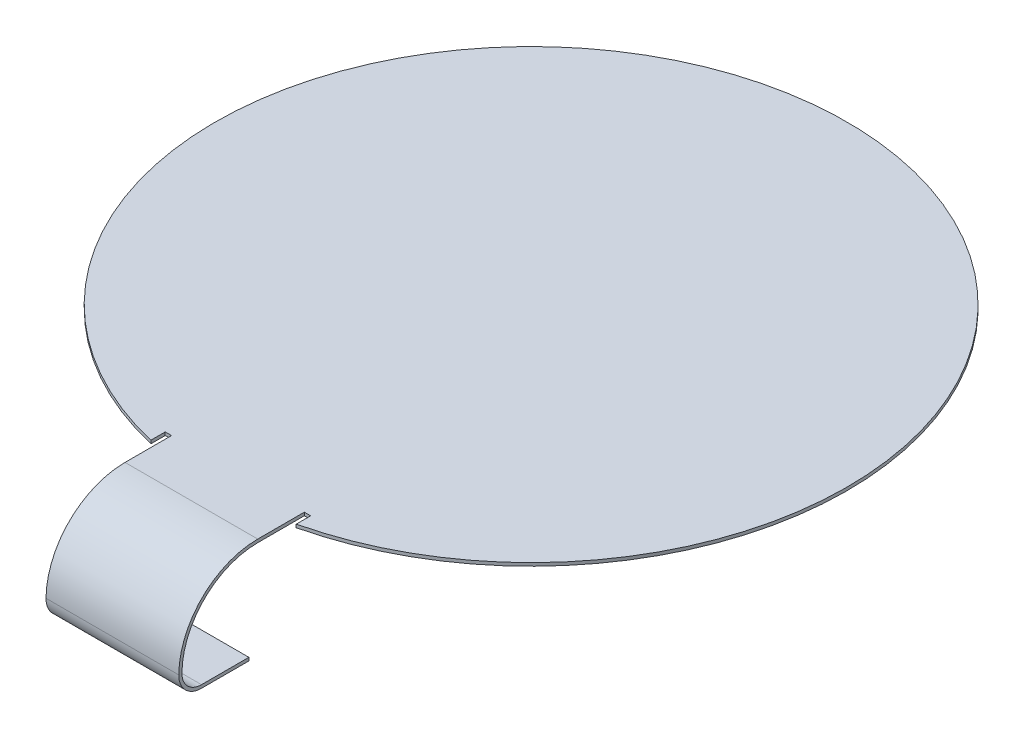
ISO-10303-21;
HEADER;
FILE_DESCRIPTION(('STEP AP214'),'2;1');
FILE_NAME('part.step','',(''),(''),'','','');
FILE_SCHEMA(('AUTOMOTIVE_DESIGN { 1 0 10303 214 1 1 1 1 }'));
ENDSEC;
DATA;
#1=APPLICATION_CONTEXT('core data for automotive mechanical design processes');
#2=APPLICATION_PROTOCOL_DEFINITION('international standard','automotive_design',2000,#1);
#3=PRODUCT_CONTEXT('',#1,'mechanical');
#4=PRODUCT('Part','Part','',(#3));
#5=PRODUCT_RELATED_PRODUCT_CATEGORY('part','',(#4));
#6=PRODUCT_DEFINITION_FORMATION('','',#4);
#7=PRODUCT_DEFINITION_CONTEXT('part definition',#1,'design');
#8=PRODUCT_DEFINITION('design','',#6,#7);
#9=PRODUCT_DEFINITION_SHAPE('','',#8);
#10=(LENGTH_UNIT() NAMED_UNIT(*) SI_UNIT(.MILLI.,.METRE.));
#11=(NAMED_UNIT(*) PLANE_ANGLE_UNIT() SI_UNIT($,.RADIAN.));
#12=(NAMED_UNIT(*) SI_UNIT($,.STERADIAN.) SOLID_ANGLE_UNIT());
#13=UNCERTAINTY_MEASURE_WITH_UNIT(LENGTH_MEASURE(1.E-05),#10,'distance_accuracy_value','');
#14=(GEOMETRIC_REPRESENTATION_CONTEXT(3) GLOBAL_UNCERTAINTY_ASSIGNED_CONTEXT((#13)) GLOBAL_UNIT_ASSIGNED_CONTEXT((#10,
#11,#12)) REPRESENTATION_CONTEXT('',''));
#15=CARTESIAN_POINT('',(0.,0.,0.));
#16=DIRECTION('',(0.,0.,1.));
#17=DIRECTION('',(1.,0.,0.));
#18=AXIS2_PLACEMENT_3D('',#15,#16,#17);
#19=CARTESIAN_POINT('',(0.,1.2,-1.53064501));
#20=DIRECTION('',(0.,-1.,0.));
#21=DIRECTION('',(0.,0.,-1.));
#22=AXIS2_PLACEMENT_3D('',#19,#20,#21);
#23=CYLINDRICAL_SURFACE('',#22,10.);
#24=CARTESIAN_POINT('',(0.,1.1,-1.53064501));
#25=DIRECTION('',(0.,1.,0.));
#26=DIRECTION('',(0.,0.,1.));
#27=AXIS2_PLACEMENT_3D('',#24,#25,#26);
#28=CIRCLE('',#27,10.);
#29=CARTESIAN_POINT('',(2.3,1.1,8.20126127808149));
#30=VERTEX_POINT('',#29);
#31=CARTESIAN_POINT('',(-2.3,1.1,8.20126127808149));
#32=VERTEX_POINT('',#31);
#33=EDGE_CURVE('E259',#30,#32,#28,.T.);
#34=ORIENTED_EDGE('',*,*,#33,.T.);
#35=DIRECTION('',(0.,-1.,0.));
#36=VECTOR('',#35,1.);
#37=CARTESIAN_POINT('',(-2.3,1.2,8.20126127808149));
#38=LINE('',#37,#36);
#39=CARTESIAN_POINT('',(-2.3,1.2,8.20126127808149));
#40=VERTEX_POINT('',#39);
#41=EDGE_CURVE('E152',#32,#40,#38,.F.);
#42=ORIENTED_EDGE('',*,*,#41,.T.);
#43=CARTESIAN_POINT('',(0.,1.2,-1.53064501));
#44=DIRECTION('',(0.,1.,0.));
#45=DIRECTION('',(0.,0.,1.));
#46=AXIS2_PLACEMENT_3D('',#43,#44,#45);
#47=CIRCLE('',#46,10.);
#48=CARTESIAN_POINT('',(2.3,1.2,8.20126127808149));
#49=VERTEX_POINT('',#48);
#50=EDGE_CURVE('E46',#49,#40,#47,.T.);
#51=ORIENTED_EDGE('',*,*,#50,.F.);
#52=DIRECTION('',(0.,-1.,0.));
#53=VECTOR('',#52,1.);
#54=CARTESIAN_POINT('',(2.3,1.2,8.20126127808149));
#55=LINE('',#54,#53);
#56=EDGE_CURVE('E183',#49,#30,#55,.T.);
#57=ORIENTED_EDGE('',*,*,#56,.T.);
#58=EDGE_LOOP('',(#34,#42,#51,#57));
#59=FACE_BOUND('',#58,.T.);
#60=ADVANCED_FACE('F38',(#59),#23,.T.);
#61=CARTESIAN_POINT('',(0.,1.2,-1.53064501));
#62=DIRECTION('',(0.,1.,0.));
#63=DIRECTION('',(0.,0.,1.));
#64=AXIS2_PLACEMENT_3D('',#61,#62,#63);
#65=PLANE('',#64);
#66=DIRECTION('',(-1.,0.,0.));
#67=VECTOR('',#66,1.);
#68=CARTESIAN_POINT('',(-2.1,1.2,7.74636884904715));
#69=LINE('',#68,#67);
#70=CARTESIAN_POINT('',(-2.1,1.2,7.74636884904715));
#71=VERTEX_POINT('',#70);
#72=CARTESIAN_POINT('',(-2.3,1.2,7.74636884904715));
#73=VERTEX_POINT('',#72);
#74=EDGE_CURVE('E159',#71,#73,#69,.T.);
#75=ORIENTED_EDGE('',*,*,#74,.F.);
#76=DIRECTION('',(0.,0.,1.));
#77=VECTOR('',#76,1.);
#78=CARTESIAN_POINT('',(-2.1,1.2,8.46935499));
#79=LINE('',#78,#77);
#80=CARTESIAN_POINT('',(-2.1,1.2,9.21935499));
#81=VERTEX_POINT('',#80);
#82=EDGE_CURVE('E139',#71,#81,#79,.T.);
#83=ORIENTED_EDGE('',*,*,#82,.T.);
#84=DIRECTION('',(-1.,0.,0.));
#85=VECTOR('',#84,1.);
#86=CARTESIAN_POINT('',(9.5423338450823,1.2,9.21935499));
#87=LINE('',#86,#85);
#88=CARTESIAN_POINT('',(2.1,1.2,9.21935499));
#89=VERTEX_POINT('',#88);
#90=EDGE_CURVE('E283',#89,#81,#87,.T.);
#91=ORIENTED_EDGE('',*,*,#90,.F.);
#92=DIRECTION('',(0.,0.,1.));
#93=VECTOR('',#92,1.);
#94=CARTESIAN_POINT('',(2.1,1.2,8.46935499));
#95=LINE('',#94,#93);
#96=CARTESIAN_POINT('',(2.1,1.2,7.74636884904715));
#97=VERTEX_POINT('',#96);
#98=EDGE_CURVE('E256',#97,#89,#95,.T.);
#99=ORIENTED_EDGE('',*,*,#98,.F.);
#100=DIRECTION('',(-1.,0.,0.));
#101=VECTOR('',#100,1.);
#102=CARTESIAN_POINT('',(2.1,1.2,7.74636884904715));
#103=LINE('',#102,#101);
#104=CARTESIAN_POINT('',(2.3,1.2,7.74636884904715));
#105=VERTEX_POINT('',#104);
#106=EDGE_CURVE('E190',#105,#97,#103,.T.);
#107=ORIENTED_EDGE('',*,*,#106,.F.);
#108=DIRECTION('',(0.,0.,-1.));
#109=VECTOR('',#108,1.);
#110=CARTESIAN_POINT('',(2.3,1.2,8.24636884904715));
#111=LINE('',#110,#109);
#112=EDGE_CURVE('E187',#49,#105,#111,.T.);
#113=ORIENTED_EDGE('',*,*,#112,.F.);
#114=ORIENTED_EDGE('',*,*,#50,.T.);
#115=DIRECTION('',(0.,0.,1.));
#116=VECTOR('',#115,1.);
#117=CARTESIAN_POINT('',(-2.3,1.2,8.24636884904715));
#118=LINE('',#117,#116);
#119=EDGE_CURVE('E165',#73,#40,#118,.T.);
#120=ORIENTED_EDGE('',*,*,#119,.F.);
#121=EDGE_LOOP('',(#75,#83,#91,#99,#107,#113,#114,#120));
#122=FACE_BOUND('',#121,.T.);
#123=ADVANCED_FACE('F167',(#122),#65,.T.);
#124=CARTESIAN_POINT('',(0.,1.1,-1.53064501));
#125=DIRECTION('',(0.,1.,0.));
#126=DIRECTION('',(0.,0.,1.));
#127=AXIS2_PLACEMENT_3D('',#124,#125,#126);
#128=PLANE('',#127);
#129=DIRECTION('',(0.,0.,1.));
#130=VECTOR('',#129,1.);
#131=CARTESIAN_POINT('',(-2.1,1.1,8.46935499));
#132=LINE('',#131,#130);
#133=CARTESIAN_POINT('',(-2.1,1.1,7.74636884904715));
#134=VERTEX_POINT('',#133);
#135=CARTESIAN_POINT('',(-2.1,1.1,9.21935499));
#136=VERTEX_POINT('',#135);
#137=EDGE_CURVE('E231',#134,#136,#132,.T.);
#138=ORIENTED_EDGE('',*,*,#137,.F.);
#139=DIRECTION('',(1.,0.,0.));
#140=VECTOR('',#139,1.);
#141=CARTESIAN_POINT('',(-2.1,1.1,7.74636884904715));
#142=LINE('',#141,#140);
#143=CARTESIAN_POINT('',(-2.3,1.1,7.74636884904715));
#144=VERTEX_POINT('',#143);
#145=EDGE_CURVE('E162',#144,#134,#142,.T.);
#146=ORIENTED_EDGE('',*,*,#145,.F.);
#147=DIRECTION('',(0.,0.,1.));
#148=VECTOR('',#147,1.);
#149=CARTESIAN_POINT('',(-2.3,1.1,-1.53064501));
#150=LINE('',#149,#148);
#151=EDGE_CURVE('E11',#144,#32,#150,.T.);
#152=ORIENTED_EDGE('',*,*,#151,.T.);
#153=ORIENTED_EDGE('',*,*,#33,.F.);
#154=DIRECTION('',(0.,0.,1.));
#155=VECTOR('',#154,1.);
#156=CARTESIAN_POINT('',(2.3,1.1,8.24636884904715));
#157=LINE('',#156,#155);
#158=CARTESIAN_POINT('',(2.3,1.1,7.74636884904715));
#159=VERTEX_POINT('',#158);
#160=EDGE_CURVE('E170',#159,#30,#157,.T.);
#161=ORIENTED_EDGE('',*,*,#160,.F.);
#162=DIRECTION('',(1.,0.,0.));
#163=VECTOR('',#162,1.);
#164=CARTESIAN_POINT('',(2.1,1.1,7.74636884904715));
#165=LINE('',#164,#163);
#166=CARTESIAN_POINT('',(2.1,1.1,7.74636884904715));
#167=VERTEX_POINT('',#166);
#168=EDGE_CURVE('E176',#167,#159,#165,.T.);
#169=ORIENTED_EDGE('',*,*,#168,.F.);
#170=DIRECTION('',(0.,0.,1.));
#171=VECTOR('',#170,1.);
#172=CARTESIAN_POINT('',(2.1,1.1,8.46935499));
#173=LINE('',#172,#171);
#174=CARTESIAN_POINT('',(2.1,1.1,9.21935499));
#175=VERTEX_POINT('',#174);
#176=EDGE_CURVE('E239',#167,#175,#173,.T.);
#177=ORIENTED_EDGE('',*,*,#176,.T.);
#178=DIRECTION('',(-1.,0.,0.));
#179=VECTOR('',#178,1.);
#180=CARTESIAN_POINT('',(9.5423338450823,1.1,9.21935499));
#181=LINE('',#180,#179);
#182=EDGE_CURVE('E234',#175,#136,#181,.T.);
#183=ORIENTED_EDGE('',*,*,#182,.T.);
#184=EDGE_LOOP('',(#138,#146,#152,#153,#161,#169,#177,#183));
#185=FACE_BOUND('',#184,.T.);
#186=ADVANCED_FACE('F297',(#185),#128,.F.);
#187=CARTESIAN_POINT('',(2.1,-1.9,9.5));
#188=DIRECTION('',(-1.,0.,0.));
#189=DIRECTION('',(0.,0.,1.));
#190=AXIS2_PLACEMENT_3D('',#187,#188,#189);
#191=PLANE('',#190);
#192=DIRECTION('',(0.,1.,0.));
#193=VECTOR('',#192,1.);
#194=CARTESIAN_POINT('',(2.1,-1.9,9.5));
#195=LINE('',#194,#193);
#196=CARTESIAN_POINT('',(2.1,-2.,9.5));
#197=VERTEX_POINT('',#196);
#198=CARTESIAN_POINT('',(2.1,-1.9,9.5));
#199=VERTEX_POINT('',#198);
#200=EDGE_CURVE('E244',#197,#199,#195,.T.);
#201=ORIENTED_EDGE('',*,*,#200,.T.);
#202=DIRECTION('',(0.,0.,-1.));
#203=VECTOR('',#202,1.);
#204=CARTESIAN_POINT('',(2.1,-1.9,10.5));
#205=LINE('',#204,#203);
#206=CARTESIAN_POINT('',(2.1,-1.9,11.));
#207=VERTEX_POINT('',#206);
#208=EDGE_CURVE('E58',#207,#199,#205,.T.);
#209=ORIENTED_EDGE('',*,*,#208,.F.);
#210=CARTESIAN_POINT('',(2.1,-1.28074906989942,11.));
#211=DIRECTION('',(-1.,0.,0.));
#212=DIRECTION('',(0.,0.,1.));
#213=AXIS2_PLACEMENT_3D('',#210,#211,#212);
#214=CIRCLE('',#213,0.619250930100584);
#215=CARTESIAN_POINT('',(2.1,-1.27405460824191,11.619214743537));
#216=VERTEX_POINT('',#215);
#217=EDGE_CURVE('E53',#216,#207,#214,.F.);
#218=ORIENTED_EDGE('',*,*,#217,.F.);
#219=CARTESIAN_POINT('',(2.1,-1.3,9.21935499));
#220=DIRECTION('',(-1.,0.,0.));
#221=DIRECTION('',(0.,0.,1.));
#222=AXIS2_PLACEMENT_3D('',#219,#220,#221);
#223=CIRCLE('',#222,2.4);
#224=EDGE_CURVE('E235',#175,#216,#223,.F.);
#225=ORIENTED_EDGE('',*,*,#224,.F.);
#226=ORIENTED_EDGE('',*,*,#176,.F.);
#227=DIRECTION('',(0.,1.,0.));
#228=VECTOR('',#227,1.);
#229=CARTESIAN_POINT('',(2.1,0.561483519286548,7.74636884904715));
#230=LINE('',#229,#228);
#231=EDGE_CURVE('E186',#167,#97,#230,.T.);
#232=ORIENTED_EDGE('',*,*,#231,.T.);
#233=ORIENTED_EDGE('',*,*,#98,.T.);
#234=CARTESIAN_POINT('',(2.1,-1.3,9.21935499));
#235=DIRECTION('',(-1.,0.,0.));
#236=DIRECTION('',(0.,0.,1.));
#237=AXIS2_PLACEMENT_3D('',#234,#235,#236);
#238=CIRCLE('',#237,2.5);
#239=CARTESIAN_POINT('',(2.1,-1.27297355025199,11.7192088999343));
#240=VERTEX_POINT('',#239);
#241=EDGE_CURVE('E253',#89,#240,#238,.F.);
#242=ORIENTED_EDGE('',*,*,#241,.T.);
#243=CARTESIAN_POINT('',(2.1,-1.28074906989942,11.));
#244=DIRECTION('',(-1.,0.,0.));
#245=DIRECTION('',(0.,0.,1.));
#246=AXIS2_PLACEMENT_3D('',#243,#244,#245);
#247=CIRCLE('',#246,0.719250930100584);
#248=CARTESIAN_POINT('',(2.1,-2.,11.));
#249=VERTEX_POINT('',#248);
#250=EDGE_CURVE('E250',#240,#249,#247,.F.);
#251=ORIENTED_EDGE('',*,*,#250,.T.);
#252=DIRECTION('',(0.,0.,-1.));
#253=VECTOR('',#252,1.);
#254=CARTESIAN_POINT('',(2.1,-2.,10.5));
#255=LINE('',#254,#253);
#256=EDGE_CURVE('E247',#249,#197,#255,.T.);
#257=ORIENTED_EDGE('',*,*,#256,.T.);
#258=EDGE_LOOP('',(#201,#209,#218,#225,#226,#232,#233,#242,#251,#257));
#259=FACE_BOUND('',#258,.T.);
#260=ADVANCED_FACE('F322',(#259),#191,.F.);
#261=CARTESIAN_POINT('',(-2.1,-1.9,10.5));
#262=DIRECTION('',(1.,0.,0.));
#263=DIRECTION('',(0.,0.,-1.));
#264=AXIS2_PLACEMENT_3D('',#261,#262,#263);
#265=PLANE('',#264);
#266=DIRECTION('',(0.,1.,0.));
#267=VECTOR('',#266,1.);
#268=CARTESIAN_POINT('',(-2.1,-1.9,9.5));
#269=LINE('',#268,#267);
#270=CARTESIAN_POINT('',(-2.1,-2.,9.5));
#271=VERTEX_POINT('',#270);
#272=CARTESIAN_POINT('',(-2.1,-1.9,9.5));
#273=VERTEX_POINT('',#272);
#274=EDGE_CURVE('E216',#271,#273,#269,.T.);
#275=ORIENTED_EDGE('',*,*,#274,.F.);
#276=DIRECTION('',(0.,0.,-1.));
#277=VECTOR('',#276,1.);
#278=CARTESIAN_POINT('',(-2.1,-2.,10.5));
#279=LINE('',#278,#277);
#280=CARTESIAN_POINT('',(-2.1,-2.,11.));
#281=VERTEX_POINT('',#280);
#282=EDGE_CURVE('E213',#281,#271,#279,.T.);
#283=ORIENTED_EDGE('',*,*,#282,.F.);
#284=CARTESIAN_POINT('',(-2.1,-1.28074906989942,11.));
#285=DIRECTION('',(1.,0.,0.));
#286=DIRECTION('',(0.,0.,-1.));
#287=AXIS2_PLACEMENT_3D('',#284,#285,#286);
#288=CIRCLE('',#287,0.719250930100584);
#289=CARTESIAN_POINT('',(-2.1,-1.27297355025199,11.7192088999343));
#290=VERTEX_POINT('',#289);
#291=EDGE_CURVE('E209',#290,#281,#288,.T.);
#292=ORIENTED_EDGE('',*,*,#291,.F.);
#293=CARTESIAN_POINT('',(-2.1,-1.3,9.21935499));
#294=DIRECTION('',(1.,0.,0.));
#295=DIRECTION('',(0.,0.,-1.));
#296=AXIS2_PLACEMENT_3D('',#293,#294,#295);
#297=CIRCLE('',#296,2.5);
#298=EDGE_CURVE('E146',#81,#290,#297,.T.);
#299=ORIENTED_EDGE('',*,*,#298,.F.);
#300=ORIENTED_EDGE('',*,*,#82,.F.);
#301=DIRECTION('',(0.,1.,0.));
#302=VECTOR('',#301,1.);
#303=CARTESIAN_POINT('',(-2.1,0.561483519286548,7.74636884904715));
#304=LINE('',#303,#302);
#305=EDGE_CURVE('E143',#134,#71,#304,.T.);
#306=ORIENTED_EDGE('',*,*,#305,.F.);
#307=ORIENTED_EDGE('',*,*,#137,.T.);
#308=CARTESIAN_POINT('',(-2.1,-1.3,9.21935499));
#309=DIRECTION('',(1.,0.,0.));
#310=DIRECTION('',(0.,0.,-1.));
#311=AXIS2_PLACEMENT_3D('',#308,#309,#310);
#312=CIRCLE('',#311,2.4);
#313=CARTESIAN_POINT('',(-2.1,-1.27405460824191,11.619214743537));
#314=VERTEX_POINT('',#313);
#315=EDGE_CURVE('E227',#136,#314,#312,.T.);
#316=ORIENTED_EDGE('',*,*,#315,.T.);
#317=CARTESIAN_POINT('',(-2.1,-1.28074906989942,11.));
#318=DIRECTION('',(1.,0.,0.));
#319=DIRECTION('',(0.,0.,-1.));
#320=AXIS2_PLACEMENT_3D('',#317,#318,#319);
#321=CIRCLE('',#320,0.619250930100584);
#322=CARTESIAN_POINT('',(-2.1,-1.9,11.));
#323=VERTEX_POINT('',#322);
#324=EDGE_CURVE('E223',#314,#323,#321,.T.);
#325=ORIENTED_EDGE('',*,*,#324,.T.);
#326=DIRECTION('',(0.,0.,-1.));
#327=VECTOR('',#326,1.);
#328=CARTESIAN_POINT('',(-2.1,-1.9,10.5));
#329=LINE('',#328,#327);
#330=EDGE_CURVE('E220',#323,#273,#329,.T.);
#331=ORIENTED_EDGE('',*,*,#330,.T.);
#332=EDGE_LOOP('',(#275,#283,#292,#299,#300,#306,#307,#316,#325,#331));
#333=FACE_BOUND('',#332,.T.);
#334=ADVANCED_FACE('F142',(#333),#265,.F.);
#335=CARTESIAN_POINT('',(9.5423338450823,-1.3,9.21935499));
#336=DIRECTION('',(-1.,0.,0.));
#337=DIRECTION('',(0.,0.,1.));
#338=AXIS2_PLACEMENT_3D('',#335,#336,#337);
#339=CYLINDRICAL_SURFACE('',#338,2.4);
#340=ORIENTED_EDGE('',*,*,#182,.F.);
#341=ORIENTED_EDGE('',*,*,#224,.T.);
#342=DIRECTION('',(-1.,0.,0.));
#343=VECTOR('',#342,1.);
#344=CARTESIAN_POINT('',(9.5423338450823,-1.27405460824191,11.619214743537));
#345=LINE('',#344,#343);
#346=EDGE_CURVE('E263',#216,#314,#345,.T.);
#347=ORIENTED_EDGE('',*,*,#346,.T.);
#348=ORIENTED_EDGE('',*,*,#315,.F.);
#349=EDGE_LOOP('',(#340,#341,#347,#348));
#350=FACE_BOUND('',#349,.T.);
#351=ADVANCED_FACE('F341',(#350),#339,.F.);
#352=CARTESIAN_POINT('',(9.5423338450823,-1.28074906989942,11.));
#353=DIRECTION('',(-1.,0.,0.));
#354=DIRECTION('',(0.,0.,1.));
#355=AXIS2_PLACEMENT_3D('',#352,#353,#354);
#356=CYLINDRICAL_SURFACE('',#355,0.619250930100584);
#357=ORIENTED_EDGE('',*,*,#346,.F.);
#358=ORIENTED_EDGE('',*,*,#217,.T.);
#359=DIRECTION('',(-1.,0.,0.));
#360=VECTOR('',#359,1.);
#361=CARTESIAN_POINT('',(9.5423338450823,-1.9,11.));
#362=LINE('',#361,#360);
#363=EDGE_CURVE('E266',#207,#323,#362,.T.);
#364=ORIENTED_EDGE('',*,*,#363,.T.);
#365=ORIENTED_EDGE('',*,*,#324,.F.);
#366=EDGE_LOOP('',(#357,#358,#364,#365));
#367=FACE_BOUND('',#366,.T.);
#368=ADVANCED_FACE('F337',(#367),#356,.F.);
#369=CARTESIAN_POINT('',(9.5423338450823,-1.9,10.5));
#370=DIRECTION('',(0.,-1.,0.));
#371=DIRECTION('',(0.,0.,-1.));
#372=AXIS2_PLACEMENT_3D('',#369,#370,#371);
#373=PLANE('',#372);
#374=DIRECTION('',(-1.,0.,0.));
#375=VECTOR('',#374,1.);
#376=CARTESIAN_POINT('',(9.5423338450823,-1.9,9.5));
#377=LINE('',#376,#375);
#378=EDGE_CURVE('E269',#199,#273,#377,.T.);
#379=ORIENTED_EDGE('',*,*,#378,.T.);
#380=ORIENTED_EDGE('',*,*,#330,.F.);
#381=ORIENTED_EDGE('',*,*,#363,.F.);
#382=ORIENTED_EDGE('',*,*,#208,.T.);
#383=EDGE_LOOP('',(#379,#380,#381,#382));
#384=FACE_BOUND('',#383,.T.);
#385=ADVANCED_FACE('F333',(#384),#373,.F.);
#386=CARTESIAN_POINT('',(9.5423338450823,-1.9,9.5));
#387=DIRECTION('',(0.,0.,-1.));
#388=DIRECTION('',(-1.,0.,0.));
#389=AXIS2_PLACEMENT_3D('',#386,#387,#388);
#390=PLANE('',#389);
#391=ORIENTED_EDGE('',*,*,#200,.F.);
#392=DIRECTION('',(-1.,0.,0.));
#393=VECTOR('',#392,1.);
#394=CARTESIAN_POINT('',(9.5423338450823,-2.,9.5));
#395=LINE('',#394,#393);
#396=EDGE_CURVE('E273',#197,#271,#395,.T.);
#397=ORIENTED_EDGE('',*,*,#396,.T.);
#398=ORIENTED_EDGE('',*,*,#274,.T.);
#399=ORIENTED_EDGE('',*,*,#378,.F.);
#400=EDGE_LOOP('',(#391,#397,#398,#399));
#401=FACE_BOUND('',#400,.T.);
#402=ADVANCED_FACE('F329',(#401),#390,.T.);
#403=CARTESIAN_POINT('',(9.5423338450823,-2.,10.5));
#404=DIRECTION('',(0.,-1.,0.));
#405=DIRECTION('',(0.,0.,-1.));
#406=AXIS2_PLACEMENT_3D('',#403,#404,#405);
#407=PLANE('',#406);
#408=ORIENTED_EDGE('',*,*,#396,.F.);
#409=ORIENTED_EDGE('',*,*,#256,.F.);
#410=DIRECTION('',(-1.,0.,0.));
#411=VECTOR('',#410,1.);
#412=CARTESIAN_POINT('',(9.5423338450823,-2.,11.));
#413=LINE('',#412,#411);
#414=EDGE_CURVE('E277',#249,#281,#413,.T.);
#415=ORIENTED_EDGE('',*,*,#414,.T.);
#416=ORIENTED_EDGE('',*,*,#282,.T.);
#417=EDGE_LOOP('',(#408,#409,#415,#416));
#418=FACE_BOUND('',#417,.T.);
#419=ADVANCED_FACE('F326',(#418),#407,.T.);
#420=CARTESIAN_POINT('',(9.5423338450823,-1.28074906989942,11.));
#421=DIRECTION('',(-1.,0.,0.));
#422=DIRECTION('',(0.,0.,1.));
#423=AXIS2_PLACEMENT_3D('',#420,#421,#422);
#424=CYLINDRICAL_SURFACE('',#423,0.719250930100584);
#425=ORIENTED_EDGE('',*,*,#250,.F.);
#426=DIRECTION('',(-1.,0.,0.));
#427=VECTOR('',#426,1.);
#428=CARTESIAN_POINT('',(9.5423338450823,-1.27297355025199,11.7192088999343));
#429=LINE('',#428,#427);
#430=EDGE_CURVE('E280',#240,#290,#429,.T.);
#431=ORIENTED_EDGE('',*,*,#430,.T.);
#432=ORIENTED_EDGE('',*,*,#291,.T.);
#433=ORIENTED_EDGE('',*,*,#414,.F.);
#434=EDGE_LOOP('',(#425,#431,#432,#433));
#435=FACE_BOUND('',#434,.T.);
#436=ADVANCED_FACE('F311',(#435),#424,.T.);
#437=CARTESIAN_POINT('',(9.5423338450823,-1.3,9.21935499));
#438=DIRECTION('',(-1.,0.,0.));
#439=DIRECTION('',(0.,0.,1.));
#440=AXIS2_PLACEMENT_3D('',#437,#438,#439);
#441=CYLINDRICAL_SURFACE('',#440,2.5);
#442=ORIENTED_EDGE('',*,*,#241,.F.);
#443=ORIENTED_EDGE('',*,*,#90,.T.);
#444=ORIENTED_EDGE('',*,*,#298,.T.);
#445=ORIENTED_EDGE('',*,*,#430,.F.);
#446=EDGE_LOOP('',(#442,#443,#444,#445));
#447=FACE_BOUND('',#446,.T.);
#448=ADVANCED_FACE('F302',(#447),#441,.T.);
#449=CARTESIAN_POINT('',(-2.3,0.561483519286548,8.24636884904715));
#450=DIRECTION('',(-1.,0.,0.));
#451=DIRECTION('',(0.,0.,1.));
#452=AXIS2_PLACEMENT_3D('',#449,#450,#451);
#453=PLANE('',#452);
#454=ORIENTED_EDGE('',*,*,#151,.F.);
#455=DIRECTION('',(0.,1.,0.));
#456=VECTOR('',#455,1.);
#457=CARTESIAN_POINT('',(-2.3,0.561483519286548,7.74636884904715));
#458=LINE('',#457,#456);
#459=EDGE_CURVE('E164',#144,#73,#458,.T.);
#460=ORIENTED_EDGE('',*,*,#459,.T.);
#461=ORIENTED_EDGE('',*,*,#119,.T.);
#462=ORIENTED_EDGE('',*,*,#41,.F.);
#463=EDGE_LOOP('',(#454,#460,#461,#462));
#464=FACE_BOUND('',#463,.T.);
#465=ADVANCED_FACE('F300',(#464),#453,.F.);
#466=CARTESIAN_POINT('',(-2.1,0.561483519286548,7.74636884904715));
#467=DIRECTION('',(0.,0.,-1.));
#468=DIRECTION('',(-1.,0.,0.));
#469=AXIS2_PLACEMENT_3D('',#466,#467,#468);
#470=PLANE('',#469);
#471=ORIENTED_EDGE('',*,*,#145,.T.);
#472=ORIENTED_EDGE('',*,*,#305,.T.);
#473=ORIENTED_EDGE('',*,*,#74,.T.);
#474=ORIENTED_EDGE('',*,*,#459,.F.);
#475=EDGE_LOOP('',(#471,#472,#473,#474));
#476=FACE_BOUND('',#475,.T.);
#477=ADVANCED_FACE('F157',(#476),#470,.F.);
#478=CARTESIAN_POINT('',(2.3,0.561483519286548,8.24636884904715));
#479=DIRECTION('',(1.,0.,0.));
#480=DIRECTION('',(0.,0.,-1.));
#481=AXIS2_PLACEMENT_3D('',#478,#479,#480);
#482=PLANE('',#481);
#483=ORIENTED_EDGE('',*,*,#112,.T.);
#484=DIRECTION('',(0.,1.,0.));
#485=VECTOR('',#484,1.);
#486=CARTESIAN_POINT('',(2.3,0.561483519286548,7.74636884904715));
#487=LINE('',#486,#485);
#488=EDGE_CURVE('E194',#159,#105,#487,.T.);
#489=ORIENTED_EDGE('',*,*,#488,.F.);
#490=ORIENTED_EDGE('',*,*,#160,.T.);
#491=ORIENTED_EDGE('',*,*,#56,.F.);
#492=EDGE_LOOP('',(#483,#489,#490,#491));
#493=FACE_BOUND('',#492,.T.);
#494=ADVANCED_FACE('F308',(#493),#482,.F.);
#495=CARTESIAN_POINT('',(2.1,0.561483519286548,7.74636884904715));
#496=DIRECTION('',(0.,0.,-1.));
#497=DIRECTION('',(-1.,0.,0.));
#498=AXIS2_PLACEMENT_3D('',#495,#496,#497);
#499=PLANE('',#498);
#500=ORIENTED_EDGE('',*,*,#168,.T.);
#501=ORIENTED_EDGE('',*,*,#488,.T.);
#502=ORIENTED_EDGE('',*,*,#106,.T.);
#503=ORIENTED_EDGE('',*,*,#231,.F.);
#504=EDGE_LOOP('',(#500,#501,#502,#503));
#505=FACE_BOUND('',#504,.T.);
#506=ADVANCED_FACE('F352',(#505),#499,.F.);
#507=CLOSED_SHELL('',(#60,#123,#186,#260,#334,#351,#368,#385,#402,#419,#436,#448,#465,#477,#494,#506));
#508=MANIFOLD_SOLID_BREP('B2',#507);
#509=ADVANCED_BREP_SHAPE_REPRESENTATION('',(#18,#508),#14);
#510=SHAPE_DEFINITION_REPRESENTATION(#9,#509);
ENDSEC;
END-ISO-10303-21;
